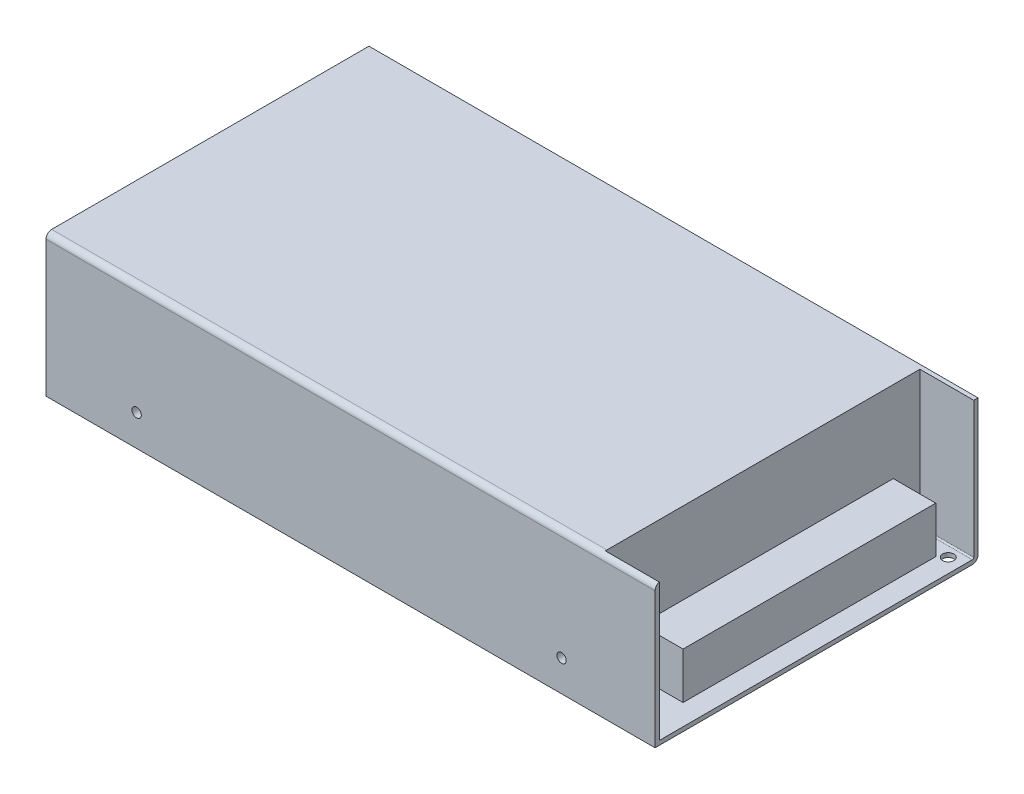
ISO-10303-21;
HEADER;
FILE_DESCRIPTION(('STEP AP214'),'2;1');
FILE_NAME('part.step','',(''),(''),'','','');
FILE_SCHEMA(('AUTOMOTIVE_DESIGN { 1 0 10303 214 1 1 1 1 }'));
ENDSEC;
DATA;
#1=APPLICATION_CONTEXT('core data for automotive mechanical design processes');
#2=APPLICATION_PROTOCOL_DEFINITION('international standard','automotive_design',2000,#1);
#3=PRODUCT_CONTEXT('',#1,'mechanical');
#4=PRODUCT('Part','Part','',(#3));
#5=PRODUCT_RELATED_PRODUCT_CATEGORY('part','',(#4));
#6=PRODUCT_DEFINITION_FORMATION('','',#4);
#7=PRODUCT_DEFINITION_CONTEXT('part definition',#1,'design');
#8=PRODUCT_DEFINITION('design','',#6,#7);
#9=PRODUCT_DEFINITION_SHAPE('','',#8);
#10=(LENGTH_UNIT() NAMED_UNIT(*) SI_UNIT(.MILLI.,.METRE.));
#11=(NAMED_UNIT(*) PLANE_ANGLE_UNIT() SI_UNIT($,.RADIAN.));
#12=(NAMED_UNIT(*) SI_UNIT($,.STERADIAN.) SOLID_ANGLE_UNIT());
#13=UNCERTAINTY_MEASURE_WITH_UNIT(LENGTH_MEASURE(1.E-05),#10,'distance_accuracy_value','');
#14=(GEOMETRIC_REPRESENTATION_CONTEXT(3) GLOBAL_UNCERTAINTY_ASSIGNED_CONTEXT((#13)) GLOBAL_UNIT_ASSIGNED_CONTEXT((#10,
#11,#12)) REPRESENTATION_CONTEXT('',''));
#15=CARTESIAN_POINT('',(0.,0.,0.));
#16=DIRECTION('',(0.,0.,1.));
#17=DIRECTION('',(1.,0.,0.));
#18=AXIS2_PLACEMENT_3D('',#15,#16,#17);
#19=CARTESIAN_POINT('',(88.5,0.,0.));
#20=DIRECTION('',(1.,0.,0.));
#21=DIRECTION('',(0.,0.,-1.));
#22=AXIS2_PLACEMENT_3D('',#19,#20,#21);
#23=PLANE('',#22);
#24=DIRECTION('',(0.,0.,1.));
#25=VECTOR('',#24,1.);
#26=CARTESIAN_POINT('',(88.5,50.,55.5));
#27=LINE('',#26,#25);
#28=CARTESIAN_POINT('',(88.5,50.,-55.5));
#29=VERTEX_POINT('',#28);
#30=CARTESIAN_POINT('',(88.5,50.,55.));
#31=VERTEX_POINT('',#30);
#32=EDGE_CURVE('E263',#29,#31,#27,.T.);
#33=ORIENTED_EDGE('',*,*,#32,.T.);
#34=CARTESIAN_POINT('',(88.5,48.,55.));
#35=DIRECTION('',(1.,0.,0.));
#36=DIRECTION('',(0.,0.,-1.));
#37=AXIS2_PLACEMENT_3D('',#34,#35,#36);
#38=CIRCLE('',#37,2.);
#39=CARTESIAN_POINT('',(88.5,49.9364916731037,55.5));
#40=VERTEX_POINT('',#39);
#41=EDGE_CURVE('E40',#31,#40,#38,.T.);
#42=ORIENTED_EDGE('',*,*,#41,.T.);
#43=DIRECTION('',(0.,-1.,0.));
#44=VECTOR('',#43,1.);
#45=CARTESIAN_POINT('',(88.5,50.,55.5));
#46=LINE('',#45,#44);
#47=CARTESIAN_POINT('',(88.5,1.5,55.5));
#48=VERTEX_POINT('',#47);
#49=EDGE_CURVE('E255',#40,#48,#46,.T.);
#50=ORIENTED_EDGE('',*,*,#49,.T.);
#51=DIRECTION('',(0.,0.,-1.));
#52=VECTOR('',#51,1.);
#53=CARTESIAN_POINT('',(88.5,1.5,55.5));
#54=LINE('',#53,#52);
#55=CARTESIAN_POINT('',(88.5,1.5,-55.));
#56=VERTEX_POINT('',#55);
#57=EDGE_CURVE('E257',#48,#56,#54,.T.);
#58=ORIENTED_EDGE('',*,*,#57,.T.);
#59=CARTESIAN_POINT('',(88.5,2.,-55.));
#60=DIRECTION('',(1.,0.,0.));
#61=DIRECTION('',(0.,0.,-1.));
#62=AXIS2_PLACEMENT_3D('',#59,#60,#61);
#63=CIRCLE('',#62,0.5);
#64=CARTESIAN_POINT('',(88.5,2.,-55.5));
#65=VERTEX_POINT('',#64);
#66=EDGE_CURVE('E307',#56,#65,#63,.T.);
#67=ORIENTED_EDGE('',*,*,#66,.T.);
#68=DIRECTION('',(0.,1.,0.));
#69=VECTOR('',#68,1.);
#70=CARTESIAN_POINT('',(88.5,50.,-55.5));
#71=LINE('',#70,#69);
#72=EDGE_CURVE('E261',#65,#29,#71,.T.);
#73=ORIENTED_EDGE('',*,*,#72,.T.);
#74=EDGE_LOOP('',(#33,#42,#50,#58,#67,#73));
#75=FACE_BOUND('',#74,.T.);
#76=DIRECTION('',(0.,0.,-1.));
#77=VECTOR('',#76,1.);
#78=CARTESIAN_POINT('',(88.5,4.89638068839784,43.1119440750721));
#79=LINE('',#78,#77);
#80=CARTESIAN_POINT('',(88.5,4.89638068839784,43.1119440750721));
#81=VERTEX_POINT('',#80);
#82=CARTESIAN_POINT('',(88.5,4.89638068839784,-46.093089144093));
#83=VERTEX_POINT('',#82);
#84=EDGE_CURVE('E241',#81,#83,#79,.T.);
#85=ORIENTED_EDGE('',*,*,#84,.F.);
#86=DIRECTION('',(0.,-1.,0.));
#87=VECTOR('',#86,1.);
#88=CARTESIAN_POINT('',(88.5,21.2544587594359,43.1119440750721));
#89=LINE('',#88,#87);
#90=CARTESIAN_POINT('',(88.5,21.2544587594359,43.1119440750721));
#91=VERTEX_POINT('',#90);
#92=EDGE_CURVE('E227',#91,#81,#89,.T.);
#93=ORIENTED_EDGE('',*,*,#92,.F.);
#94=DIRECTION('',(0.,0.,1.));
#95=VECTOR('',#94,1.);
#96=CARTESIAN_POINT('',(88.5,21.2544587594359,43.1119440750721));
#97=LINE('',#96,#95);
#98=CARTESIAN_POINT('',(88.5,21.2544587594359,-46.093089144093));
#99=VERTEX_POINT('',#98);
#100=EDGE_CURVE('E232',#99,#91,#97,.T.);
#101=ORIENTED_EDGE('',*,*,#100,.F.);
#102=DIRECTION('',(0.,1.,0.));
#103=VECTOR('',#102,1.);
#104=CARTESIAN_POINT('',(88.5,21.2544587594359,-46.093089144093));
#105=LINE('',#104,#103);
#106=EDGE_CURVE('E243',#83,#99,#105,.T.);
#107=ORIENTED_EDGE('',*,*,#106,.F.);
#108=EDGE_LOOP('',(#85,#93,#101,#107));
#109=FACE_BOUND('',#108,.T.);
#110=ADVANCED_FACE('F17',(#75,#109),#23,.T.);
#111=CARTESIAN_POINT('',(-107.5,50.,57.));
#112=DIRECTION('',(1.,0.,0.));
#113=DIRECTION('',(0.,0.,-1.));
#114=AXIS2_PLACEMENT_3D('',#111,#112,#113);
#115=PLANE('',#114);
#116=DIRECTION('',(0.,-1.,0.));
#117=VECTOR('',#116,1.);
#118=CARTESIAN_POINT('',(-107.5,50.,-57.));
#119=LINE('',#118,#117);
#120=CARTESIAN_POINT('',(-107.5,50.,-57.));
#121=VERTEX_POINT('',#120);
#122=CARTESIAN_POINT('',(-107.5,2.,-57.));
#123=VERTEX_POINT('',#122);
#124=EDGE_CURVE('E285',#121,#123,#119,.T.);
#125=ORIENTED_EDGE('',*,*,#124,.T.);
#126=CARTESIAN_POINT('',(-107.5,2.,-55.));
#127=DIRECTION('',(1.,0.,0.));
#128=DIRECTION('',(0.,0.,-1.));
#129=AXIS2_PLACEMENT_3D('',#126,#127,#128);
#130=CIRCLE('',#129,2.);
#131=CARTESIAN_POINT('',(-107.5,0.,-55.));
#132=VERTEX_POINT('',#131);
#133=EDGE_CURVE('E316',#123,#132,#130,.F.);
#134=ORIENTED_EDGE('',*,*,#133,.T.);
#135=DIRECTION('',(0.,0.,1.));
#136=VECTOR('',#135,1.);
#137=CARTESIAN_POINT('',(-107.5,0.,57.));
#138=LINE('',#137,#136);
#139=CARTESIAN_POINT('',(-107.5,0.,57.));
#140=VERTEX_POINT('',#139);
#141=EDGE_CURVE('E274',#132,#140,#138,.T.);
#142=ORIENTED_EDGE('',*,*,#141,.T.);
#143=DIRECTION('',(0.,-1.,0.));
#144=VECTOR('',#143,1.);
#145=CARTESIAN_POINT('',(-107.5,50.,57.));
#146=LINE('',#145,#144);
#147=CARTESIAN_POINT('',(-107.5,48.,57.));
#148=VERTEX_POINT('',#147);
#149=EDGE_CURVE('E300',#148,#140,#146,.T.);
#150=ORIENTED_EDGE('',*,*,#149,.F.);
#151=CARTESIAN_POINT('',(-107.5,48.,55.));
#152=DIRECTION('',(1.,0.,0.));
#153=DIRECTION('',(0.,0.,-1.));
#154=AXIS2_PLACEMENT_3D('',#151,#152,#153);
#155=CIRCLE('',#154,2.);
#156=CARTESIAN_POINT('',(-107.5,50.,55.));
#157=VERTEX_POINT('',#156);
#158=EDGE_CURVE('E314',#148,#157,#155,.F.);
#159=ORIENTED_EDGE('',*,*,#158,.T.);
#160=DIRECTION('',(0.,0.,1.));
#161=VECTOR('',#160,1.);
#162=CARTESIAN_POINT('',(-107.5,50.,57.));
#163=LINE('',#162,#161);
#164=EDGE_CURVE('E277',#121,#157,#163,.T.);
#165=ORIENTED_EDGE('',*,*,#164,.F.);
#166=EDGE_LOOP('',(#125,#134,#142,#150,#159,#165));
#167=FACE_BOUND('',#166,.T.);
#168=ADVANCED_FACE('F345',(#167),#115,.F.);
#169=CARTESIAN_POINT('',(107.5,50.,57.));
#170=DIRECTION('',(0.,0.,-1.));
#171=DIRECTION('',(-1.,0.,0.));
#172=AXIS2_PLACEMENT_3D('',#169,#170,#171);
#173=PLANE('',#172);
#174=CARTESIAN_POINT('',(74.5,11.,57.));
#175=DIRECTION('',(0.,0.,1.));
#176=DIRECTION('',(1.,0.,0.));
#177=AXIS2_PLACEMENT_3D('',#174,#175,#176);
#178=CIRCLE('',#177,1.65);
#179=CARTESIAN_POINT('',(76.15,11.,57.));
#180=VERTEX_POINT('',#179);
#181=EDGE_CURVE('E163',#180,#180,#178,.T.);
#182=ORIENTED_EDGE('',*,*,#181,.F.);
#183=EDGE_LOOP('',(#182));
#184=FACE_BOUND('',#183,.T.);
#185=CARTESIAN_POINT('',(-75.5,11.,57.));
#186=DIRECTION('',(0.,0.,1.));
#187=DIRECTION('',(1.,0.,0.));
#188=AXIS2_PLACEMENT_3D('',#185,#186,#187);
#189=CIRCLE('',#188,1.65);
#190=CARTESIAN_POINT('',(-73.85,11.,57.));
#191=VERTEX_POINT('',#190);
#192=EDGE_CURVE('E162',#191,#191,#189,.T.);
#193=ORIENTED_EDGE('',*,*,#192,.F.);
#194=EDGE_LOOP('',(#193));
#195=FACE_BOUND('',#194,.T.);
#196=DIRECTION('',(0.,-1.,0.));
#197=VECTOR('',#196,1.);
#198=CARTESIAN_POINT('',(107.5,50.,57.));
#199=LINE('',#198,#197);
#200=CARTESIAN_POINT('',(107.5,48.,57.));
#201=VERTEX_POINT('',#200);
#202=CARTESIAN_POINT('',(107.5,0.,57.));
#203=VERTEX_POINT('',#202);
#204=EDGE_CURVE('E298',#201,#203,#199,.T.);
#205=ORIENTED_EDGE('',*,*,#204,.F.);
#206=DIRECTION('',(1.,0.,0.));
#207=VECTOR('',#206,1.);
#208=CARTESIAN_POINT('',(-107.5,48.,57.));
#209=LINE('',#208,#207);
#210=EDGE_CURVE('E11',#201,#148,#209,.F.);
#211=ORIENTED_EDGE('',*,*,#210,.T.);
#212=ORIENTED_EDGE('',*,*,#149,.T.);
#213=DIRECTION('',(1.,0.,0.));
#214=VECTOR('',#213,1.);
#215=CARTESIAN_POINT('',(107.5,0.,57.));
#216=LINE('',#215,#214);
#217=EDGE_CURVE('E288',#140,#203,#216,.T.);
#218=ORIENTED_EDGE('',*,*,#217,.T.);
#219=EDGE_LOOP('',(#205,#211,#212,#218));
#220=FACE_BOUND('',#219,.T.);
#221=ADVANCED_FACE('F343',(#184,#195,#220),#173,.F.);
#222=CARTESIAN_POINT('',(107.5,50.,57.));
#223=DIRECTION('',(-1.,0.,0.));
#224=DIRECTION('',(0.,0.,1.));
#225=AXIS2_PLACEMENT_3D('',#222,#223,#224);
#226=PLANE('',#225);
#227=DIRECTION('',(0.,0.,-1.));
#228=VECTOR('',#227,1.);
#229=CARTESIAN_POINT('',(107.5,0.,57.));
#230=LINE('',#229,#228);
#231=CARTESIAN_POINT('',(107.5,0.,-55.));
#232=VERTEX_POINT('',#231);
#233=EDGE_CURVE('E281',#203,#232,#230,.T.);
#234=ORIENTED_EDGE('',*,*,#233,.T.);
#235=CARTESIAN_POINT('',(107.5,2.,-55.));
#236=DIRECTION('',(-1.,0.,0.));
#237=DIRECTION('',(0.,0.,1.));
#238=AXIS2_PLACEMENT_3D('',#235,#236,#237);
#239=CIRCLE('',#238,2.);
#240=CARTESIAN_POINT('',(107.5,2.,-57.));
#241=VERTEX_POINT('',#240);
#242=EDGE_CURVE('E322',#232,#241,#239,.F.);
#243=ORIENTED_EDGE('',*,*,#242,.T.);
#244=DIRECTION('',(0.,-1.,0.));
#245=VECTOR('',#244,1.);
#246=CARTESIAN_POINT('',(107.5,50.,-57.));
#247=LINE('',#246,#245);
#248=CARTESIAN_POINT('',(107.5,50.,-57.));
#249=VERTEX_POINT('',#248);
#250=EDGE_CURVE('E295',#249,#241,#247,.T.);
#251=ORIENTED_EDGE('',*,*,#250,.F.);
#252=DIRECTION('',(0.,0.,-1.));
#253=VECTOR('',#252,1.);
#254=CARTESIAN_POINT('',(107.5,50.,57.));
#255=LINE('',#254,#253);
#256=CARTESIAN_POINT('',(107.5,50.,-55.5));
#257=VERTEX_POINT('',#256);
#258=EDGE_CURVE('E280',#257,#249,#255,.T.);
#259=ORIENTED_EDGE('',*,*,#258,.F.);
#260=DIRECTION('',(0.,1.,0.));
#261=VECTOR('',#260,1.);
#262=CARTESIAN_POINT('',(107.5,50.,-55.5));
#263=LINE('',#262,#261);
#264=CARTESIAN_POINT('',(107.5,2.,-55.5));
#265=VERTEX_POINT('',#264);
#266=EDGE_CURVE('E258',#265,#257,#263,.T.);
#267=ORIENTED_EDGE('',*,*,#266,.F.);
#268=CARTESIAN_POINT('',(107.5,2.,-55.));
#269=DIRECTION('',(-1.,0.,0.));
#270=DIRECTION('',(0.,0.,1.));
#271=AXIS2_PLACEMENT_3D('',#268,#269,#270);
#272=CIRCLE('',#271,0.5);
#273=CARTESIAN_POINT('',(107.5,1.5,-55.));
#274=VERTEX_POINT('',#273);
#275=EDGE_CURVE('E309',#265,#274,#272,.T.);
#276=ORIENTED_EDGE('',*,*,#275,.T.);
#277=DIRECTION('',(0.,0.,-1.));
#278=VECTOR('',#277,1.);
#279=CARTESIAN_POINT('',(107.5,1.5,55.5));
#280=LINE('',#279,#278);
#281=CARTESIAN_POINT('',(107.5,1.5,55.5));
#282=VERTEX_POINT('',#281);
#283=EDGE_CURVE('E267',#282,#274,#280,.T.);
#284=ORIENTED_EDGE('',*,*,#283,.F.);
#285=DIRECTION('',(0.,-1.,0.));
#286=VECTOR('',#285,1.);
#287=CARTESIAN_POINT('',(107.5,50.,55.5));
#288=LINE('',#287,#286);
#289=CARTESIAN_POINT('',(107.5,49.9364916731037,55.5));
#290=VERTEX_POINT('',#289);
#291=EDGE_CURVE('E254',#290,#282,#288,.T.);
#292=ORIENTED_EDGE('',*,*,#291,.F.);
#293=CARTESIAN_POINT('',(107.5,48.,55.));
#294=DIRECTION('',(-1.,0.,0.));
#295=DIRECTION('',(0.,0.,1.));
#296=AXIS2_PLACEMENT_3D('',#293,#294,#295);
#297=CIRCLE('',#296,2.);
#298=EDGE_CURVE('E320',#290,#201,#297,.F.);
#299=ORIENTED_EDGE('',*,*,#298,.T.);
#300=ORIENTED_EDGE('',*,*,#204,.T.);
#301=EDGE_LOOP('',(#234,#243,#251,#259,#267,#276,#284,#292,#299,#300));
#302=FACE_BOUND('',#301,.T.);
#303=ADVANCED_FACE('F336',(#302),#226,.F.);
#304=CARTESIAN_POINT('',(107.5,50.,-57.));
#305=DIRECTION('',(0.,0.,1.));
#306=DIRECTION('',(1.,0.,0.));
#307=AXIS2_PLACEMENT_3D('',#304,#305,#306);
#308=PLANE('',#307);
#309=CARTESIAN_POINT('',(-74.2,37.5,-57.));
#310=DIRECTION('',(0.,0.,-1.));
#311=DIRECTION('',(-1.,0.,0.));
#312=AXIS2_PLACEMENT_3D('',#309,#310,#311);
#313=CIRCLE('',#312,1.65);
#314=CARTESIAN_POINT('',(-75.85,37.5,-57.));
#315=VERTEX_POINT('',#314);
#316=EDGE_CURVE('E177',#315,#315,#313,.T.);
#317=ORIENTED_EDGE('',*,*,#316,.F.);
#318=EDGE_LOOP('',(#317));
#319=FACE_BOUND('',#318,.T.);
#320=CARTESIAN_POINT('',(-74.2,12.5,-57.));
#321=DIRECTION('',(0.,0.,-1.));
#322=DIRECTION('',(-1.,0.,0.));
#323=AXIS2_PLACEMENT_3D('',#320,#321,#322);
#324=CIRCLE('',#323,1.65);
#325=CARTESIAN_POINT('',(-75.85,12.5,-57.));
#326=VERTEX_POINT('',#325);
#327=EDGE_CURVE('E185',#326,#326,#324,.T.);
#328=ORIENTED_EDGE('',*,*,#327,.F.);
#329=EDGE_LOOP('',(#328));
#330=FACE_BOUND('',#329,.T.);
#331=CARTESIAN_POINT('',(75.,37.5,-57.));
#332=DIRECTION('',(0.,0.,-1.));
#333=DIRECTION('',(-1.,0.,0.));
#334=AXIS2_PLACEMENT_3D('',#331,#332,#333);
#335=CIRCLE('',#334,1.65);
#336=CARTESIAN_POINT('',(73.35,37.5,-57.));
#337=VERTEX_POINT('',#336);
#338=EDGE_CURVE('E191',#337,#337,#335,.T.);
#339=ORIENTED_EDGE('',*,*,#338,.F.);
#340=EDGE_LOOP('',(#339));
#341=FACE_BOUND('',#340,.T.);
#342=CARTESIAN_POINT('',(75.,12.5,-57.));
#343=DIRECTION('',(0.,0.,-1.));
#344=DIRECTION('',(-1.,0.,0.));
#345=AXIS2_PLACEMENT_3D('',#342,#343,#344);
#346=CIRCLE('',#345,1.65);
#347=CARTESIAN_POINT('',(73.35,12.5,-57.));
#348=VERTEX_POINT('',#347);
#349=EDGE_CURVE('E197',#348,#348,#346,.T.);
#350=ORIENTED_EDGE('',*,*,#349,.F.);
#351=EDGE_LOOP('',(#350));
#352=FACE_BOUND('',#351,.T.);
#353=ORIENTED_EDGE('',*,*,#250,.T.);
#354=DIRECTION('',(-1.,0.,0.));
#355=VECTOR('',#354,1.);
#356=CARTESIAN_POINT('',(107.5,2.,-57.));
#357=LINE('',#356,#355);
#358=EDGE_CURVE('E311',#241,#123,#357,.T.);
#359=ORIENTED_EDGE('',*,*,#358,.T.);
#360=ORIENTED_EDGE('',*,*,#124,.F.);
#361=DIRECTION('',(-1.,0.,0.));
#362=VECTOR('',#361,1.);
#363=CARTESIAN_POINT('',(107.5,50.,-57.));
#364=LINE('',#363,#362);
#365=EDGE_CURVE('E283',#249,#121,#364,.T.);
#366=ORIENTED_EDGE('',*,*,#365,.F.);
#367=EDGE_LOOP('',(#353,#359,#360,#366));
#368=FACE_BOUND('',#367,.T.);
#369=ADVANCED_FACE('F360',(#319,#330,#341,#352,#368),#308,.F.);
#370=CARTESIAN_POINT('',(0.,50.,0.));
#371=DIRECTION('',(0.,1.,0.));
#372=DIRECTION('',(0.,0.,1.));
#373=AXIS2_PLACEMENT_3D('',#370,#371,#372);
#374=PLANE('',#373);
#375=ORIENTED_EDGE('',*,*,#164,.T.);
#376=DIRECTION('',(1.,0.,0.));
#377=VECTOR('',#376,1.);
#378=CARTESIAN_POINT('',(107.5,50.,55.));
#379=LINE('',#378,#377);
#380=EDGE_CURVE('E324',#157,#31,#379,.T.);
#381=ORIENTED_EDGE('',*,*,#380,.T.);
#382=ORIENTED_EDGE('',*,*,#32,.F.);
#383=DIRECTION('',(1.,0.,0.));
#384=VECTOR('',#383,1.);
#385=CARTESIAN_POINT('',(88.5,50.,-55.5));
#386=LINE('',#385,#384);
#387=EDGE_CURVE('E271',#29,#257,#386,.T.);
#388=ORIENTED_EDGE('',*,*,#387,.T.);
#389=ORIENTED_EDGE('',*,*,#258,.T.);
#390=ORIENTED_EDGE('',*,*,#365,.T.);
#391=EDGE_LOOP('',(#375,#381,#382,#388,#389,#390));
#392=FACE_BOUND('',#391,.T.);
#393=ADVANCED_FACE('F363',(#392),#374,.T.);
#394=CARTESIAN_POINT('',(0.,0.,0.));
#395=DIRECTION('',(0.,1.,0.));
#396=DIRECTION('',(0.,0.,1.));
#397=AXIS2_PLACEMENT_3D('',#394,#395,#396);
#398=PLANE('',#397);
#399=CARTESIAN_POINT('',(102.5,0.,-51.5));
#400=DIRECTION('',(0.,1.,0.));
#401=DIRECTION('',(0.,0.,1.));
#402=AXIS2_PLACEMENT_3D('',#399,#400,#401);
#403=CIRCLE('',#402,2.);
#404=CARTESIAN_POINT('',(102.5,0.,-49.5));
#405=VERTEX_POINT('',#404);
#406=EDGE_CURVE('E174',#405,#405,#403,.T.);
#407=ORIENTED_EDGE('',*,*,#406,.T.);
#408=EDGE_LOOP('',(#407));
#409=FACE_BOUND('',#408,.T.);
#410=CARTESIAN_POINT('',(-75.5,0.,-25.));
#411=DIRECTION('',(0.,-1.,0.));
#412=DIRECTION('',(0.,0.,-1.));
#413=AXIS2_PLACEMENT_3D('',#410,#411,#412);
#414=CIRCLE('',#413,1.65);
#415=CARTESIAN_POINT('',(-75.5,0.,-26.65));
#416=VERTEX_POINT('',#415);
#417=EDGE_CURVE('E203',#416,#416,#414,.T.);
#418=ORIENTED_EDGE('',*,*,#417,.F.);
#419=EDGE_LOOP('',(#418));
#420=FACE_BOUND('',#419,.T.);
#421=CARTESIAN_POINT('',(-75.5,0.,25.));
#422=DIRECTION('',(0.,-1.,0.));
#423=DIRECTION('',(0.,0.,-1.));
#424=AXIS2_PLACEMENT_3D('',#421,#422,#423);
#425=CIRCLE('',#424,1.65);
#426=CARTESIAN_POINT('',(-75.5,0.,23.35));
#427=VERTEX_POINT('',#426);
#428=EDGE_CURVE('E209',#427,#427,#425,.T.);
#429=ORIENTED_EDGE('',*,*,#428,.F.);
#430=EDGE_LOOP('',(#429));
#431=FACE_BOUND('',#430,.T.);
#432=CARTESIAN_POINT('',(74.5,0.,-25.));
#433=DIRECTION('',(0.,-1.,0.));
#434=DIRECTION('',(0.,0.,-1.));
#435=AXIS2_PLACEMENT_3D('',#432,#433,#434);
#436=CIRCLE('',#435,1.65);
#437=CARTESIAN_POINT('',(74.5,0.,-26.65));
#438=VERTEX_POINT('',#437);
#439=EDGE_CURVE('E215',#438,#438,#436,.T.);
#440=ORIENTED_EDGE('',*,*,#439,.F.);
#441=EDGE_LOOP('',(#440));
#442=FACE_BOUND('',#441,.T.);
#443=CARTESIAN_POINT('',(74.5,0.,25.));
#444=DIRECTION('',(0.,-1.,0.));
#445=DIRECTION('',(0.,0.,-1.));
#446=AXIS2_PLACEMENT_3D('',#443,#444,#445);
#447=CIRCLE('',#446,1.65);
#448=CARTESIAN_POINT('',(74.5,0.,23.35));
#449=VERTEX_POINT('',#448);
#450=EDGE_CURVE('E221',#449,#449,#447,.T.);
#451=ORIENTED_EDGE('',*,*,#450,.F.);
#452=EDGE_LOOP('',(#451));
#453=FACE_BOUND('',#452,.T.);
#454=ORIENTED_EDGE('',*,*,#141,.F.);
#455=DIRECTION('',(-1.,0.,0.));
#456=VECTOR('',#455,1.);
#457=CARTESIAN_POINT('',(0.,0.,-55.));
#458=LINE('',#457,#456);
#459=EDGE_CURVE('E318',#132,#232,#458,.F.);
#460=ORIENTED_EDGE('',*,*,#459,.T.);
#461=ORIENTED_EDGE('',*,*,#233,.F.);
#462=ORIENTED_EDGE('',*,*,#217,.F.);
#463=EDGE_LOOP('',(#454,#460,#461,#462));
#464=FACE_BOUND('',#463,.T.);
#465=ADVANCED_FACE('F352',(#409,#420,#431,#442,#453,#464),#398,.F.);
#466=CARTESIAN_POINT('',(88.5,50.,55.5));
#467=DIRECTION('',(0.,0.,1.));
#468=DIRECTION('',(1.,0.,0.));
#469=AXIS2_PLACEMENT_3D('',#466,#467,#468);
#470=PLANE('',#469);
#471=ORIENTED_EDGE('',*,*,#49,.F.);
#472=DIRECTION('',(-1.,0.,0.));
#473=VECTOR('',#472,1.);
#474=CARTESIAN_POINT('',(88.5,49.9364916731037,55.5));
#475=LINE('',#474,#473);
#476=EDGE_CURVE('E25',#40,#290,#475,.F.);
#477=ORIENTED_EDGE('',*,*,#476,.T.);
#478=ORIENTED_EDGE('',*,*,#291,.T.);
#479=DIRECTION('',(1.,0.,0.));
#480=VECTOR('',#479,1.);
#481=CARTESIAN_POINT('',(88.5,1.5,55.5));
#482=LINE('',#481,#480);
#483=EDGE_CURVE('E265',#48,#282,#482,.T.);
#484=ORIENTED_EDGE('',*,*,#483,.F.);
#485=EDGE_LOOP('',(#471,#477,#478,#484));
#486=FACE_BOUND('',#485,.T.);
#487=ADVANCED_FACE('F330',(#486),#470,.F.);
#488=CARTESIAN_POINT('',(88.5,50.,-55.5));
#489=DIRECTION('',(0.,0.,-1.));
#490=DIRECTION('',(-1.,0.,0.));
#491=AXIS2_PLACEMENT_3D('',#488,#489,#490);
#492=PLANE('',#491);
#493=ORIENTED_EDGE('',*,*,#72,.F.);
#494=DIRECTION('',(1.,0.,0.));
#495=VECTOR('',#494,1.);
#496=CARTESIAN_POINT('',(107.5,2.,-55.5));
#497=LINE('',#496,#495);
#498=EDGE_CURVE('E302',#65,#265,#497,.T.);
#499=ORIENTED_EDGE('',*,*,#498,.T.);
#500=ORIENTED_EDGE('',*,*,#266,.T.);
#501=ORIENTED_EDGE('',*,*,#387,.F.);
#502=EDGE_LOOP('',(#493,#499,#500,#501));
#503=FACE_BOUND('',#502,.T.);
#504=ADVANCED_FACE('F370',(#503),#492,.F.);
#505=CARTESIAN_POINT('',(88.5,1.5,55.5));
#506=DIRECTION('',(0.,-1.,0.));
#507=DIRECTION('',(0.,0.,-1.));
#508=AXIS2_PLACEMENT_3D('',#505,#506,#507);
#509=PLANE('',#508);
#510=CARTESIAN_POINT('',(102.5,1.5,-51.5));
#511=DIRECTION('',(0.,1.,0.));
#512=DIRECTION('',(0.,0.,1.));
#513=AXIS2_PLACEMENT_3D('',#510,#511,#512);
#514=CIRCLE('',#513,2.);
#515=CARTESIAN_POINT('',(102.5,1.5,-49.5));
#516=VERTEX_POINT('',#515);
#517=EDGE_CURVE('E173',#516,#516,#514,.T.);
#518=ORIENTED_EDGE('',*,*,#517,.F.);
#519=EDGE_LOOP('',(#518));
#520=FACE_BOUND('',#519,.T.);
#521=ORIENTED_EDGE('',*,*,#283,.T.);
#522=DIRECTION('',(1.,0.,0.));
#523=VECTOR('',#522,1.);
#524=CARTESIAN_POINT('',(88.5,1.5,-55.));
#525=LINE('',#524,#523);
#526=EDGE_CURVE('E305',#274,#56,#525,.F.);
#527=ORIENTED_EDGE('',*,*,#526,.T.);
#528=ORIENTED_EDGE('',*,*,#57,.F.);
#529=ORIENTED_EDGE('',*,*,#483,.T.);
#530=EDGE_LOOP('',(#521,#527,#528,#529));
#531=FACE_BOUND('',#530,.T.);
#532=ADVANCED_FACE('F378',(#520,#531),#509,.F.);
#533=CARTESIAN_POINT('',(88.5,2.,-55.));
#534=DIRECTION('',(-1.,0.,0.));
#535=DIRECTION('',(0.,0.,1.));
#536=AXIS2_PLACEMENT_3D('',#533,#534,#535);
#537=CYLINDRICAL_SURFACE('',#536,0.5);
#538=ORIENTED_EDGE('',*,*,#66,.F.);
#539=ORIENTED_EDGE('',*,*,#526,.F.);
#540=ORIENTED_EDGE('',*,*,#275,.F.);
#541=ORIENTED_EDGE('',*,*,#498,.F.);
#542=EDGE_LOOP('',(#538,#539,#540,#541));
#543=FACE_BOUND('',#542,.T.);
#544=ADVANCED_FACE('F374',(#543),#537,.F.);
#545=CARTESIAN_POINT('',(107.5,2.,-55.));
#546=DIRECTION('',(-1.,0.,0.));
#547=DIRECTION('',(0.,0.,1.));
#548=AXIS2_PLACEMENT_3D('',#545,#546,#547);
#549=CYLINDRICAL_SURFACE('',#548,2.);
#550=ORIENTED_EDGE('',*,*,#242,.F.);
#551=ORIENTED_EDGE('',*,*,#459,.F.);
#552=ORIENTED_EDGE('',*,*,#133,.F.);
#553=ORIENTED_EDGE('',*,*,#358,.F.);
#554=EDGE_LOOP('',(#550,#551,#552,#553));
#555=FACE_BOUND('',#554,.T.);
#556=ADVANCED_FACE('F357',(#555),#549,.T.);
#557=CARTESIAN_POINT('',(0.,48.,55.));
#558=DIRECTION('',(-1.,0.,0.));
#559=DIRECTION('',(0.,0.,1.));
#560=AXIS2_PLACEMENT_3D('',#557,#558,#559);
#561=CYLINDRICAL_SURFACE('',#560,2.);
#562=ORIENTED_EDGE('',*,*,#158,.F.);
#563=ORIENTED_EDGE('',*,*,#210,.F.);
#564=ORIENTED_EDGE('',*,*,#298,.F.);
#565=ORIENTED_EDGE('',*,*,#476,.F.);
#566=ORIENTED_EDGE('',*,*,#41,.F.);
#567=ORIENTED_EDGE('',*,*,#380,.F.);
#568=EDGE_LOOP('',(#562,#563,#564,#565,#566,#567));
#569=FACE_BOUND('',#568,.T.);
#570=ADVANCED_FACE('F19',(#569),#561,.T.);
#571=CARTESIAN_POINT('',(103.5,21.2544587594359,43.1119440750721));
#572=DIRECTION('',(0.,0.,-1.));
#573=DIRECTION('',(-1.,0.,0.));
#574=AXIS2_PLACEMENT_3D('',#571,#572,#573);
#575=PLANE('',#574);
#576=ORIENTED_EDGE('',*,*,#92,.T.);
#577=DIRECTION('',(-1.,0.,0.));
#578=VECTOR('',#577,1.);
#579=CARTESIAN_POINT('',(103.5,4.89638068839784,43.1119440750721));
#580=LINE('',#579,#578);
#581=CARTESIAN_POINT('',(103.5,4.89638068839784,43.1119440750721));
#582=VERTEX_POINT('',#581);
#583=EDGE_CURVE('E252',#582,#81,#580,.T.);
#584=ORIENTED_EDGE('',*,*,#583,.F.);
#585=DIRECTION('',(0.,-1.,0.));
#586=VECTOR('',#585,1.);
#587=CARTESIAN_POINT('',(103.5,21.2544587594359,43.1119440750721));
#588=LINE('',#587,#586);
#589=CARTESIAN_POINT('',(103.5,21.2544587594359,43.1119440750721));
#590=VERTEX_POINT('',#589);
#591=EDGE_CURVE('E228',#590,#582,#588,.T.);
#592=ORIENTED_EDGE('',*,*,#591,.F.);
#593=DIRECTION('',(-1.,0.,0.));
#594=VECTOR('',#593,1.);
#595=CARTESIAN_POINT('',(103.5,21.2544587594359,43.1119440750721));
#596=LINE('',#595,#594);
#597=EDGE_CURVE('E238',#590,#91,#596,.T.);
#598=ORIENTED_EDGE('',*,*,#597,.T.);
#599=EDGE_LOOP('',(#576,#584,#592,#598));
#600=FACE_BOUND('',#599,.T.);
#601=ADVANCED_FACE('F398',(#600),#575,.F.);
#602=CARTESIAN_POINT('',(103.5,4.89638068839784,43.1119440750721));
#603=DIRECTION('',(0.,1.,0.));
#604=DIRECTION('',(-1.,0.,0.));
#605=AXIS2_PLACEMENT_3D('',#602,#603,#604);
#606=PLANE('',#605);
#607=ORIENTED_EDGE('',*,*,#84,.T.);
#608=DIRECTION('',(-1.,0.,0.));
#609=VECTOR('',#608,1.);
#610=CARTESIAN_POINT('',(103.5,4.89638068839784,-46.093089144093));
#611=LINE('',#610,#609);
#612=CARTESIAN_POINT('',(103.5,4.89638068839784,-46.093089144093));
#613=VERTEX_POINT('',#612);
#614=EDGE_CURVE('E249',#613,#83,#611,.T.);
#615=ORIENTED_EDGE('',*,*,#614,.F.);
#616=DIRECTION('',(0.,0.,-1.));
#617=VECTOR('',#616,1.);
#618=CARTESIAN_POINT('',(103.5,4.89638068839784,43.1119440750721));
#619=LINE('',#618,#617);
#620=EDGE_CURVE('E231',#582,#613,#619,.T.);
#621=ORIENTED_EDGE('',*,*,#620,.F.);
#622=ORIENTED_EDGE('',*,*,#583,.T.);
#623=EDGE_LOOP('',(#607,#615,#621,#622));
#624=FACE_BOUND('',#623,.T.);
#625=ADVANCED_FACE('F388',(#624),#606,.F.);
#626=CARTESIAN_POINT('',(103.5,21.2544587594359,-46.093089144093));
#627=DIRECTION('',(0.,0.,1.));
#628=DIRECTION('',(1.,0.,0.));
#629=AXIS2_PLACEMENT_3D('',#626,#627,#628);
#630=PLANE('',#629);
#631=ORIENTED_EDGE('',*,*,#106,.T.);
#632=DIRECTION('',(-1.,0.,0.));
#633=VECTOR('',#632,1.);
#634=CARTESIAN_POINT('',(103.5,21.2544587594359,-46.093089144093));
#635=LINE('',#634,#633);
#636=CARTESIAN_POINT('',(103.5,21.2544587594359,-46.093089144093));
#637=VERTEX_POINT('',#636);
#638=EDGE_CURVE('E32',#637,#99,#635,.T.);
#639=ORIENTED_EDGE('',*,*,#638,.F.);
#640=DIRECTION('',(0.,1.,0.));
#641=VECTOR('',#640,1.);
#642=CARTESIAN_POINT('',(103.5,21.2544587594359,-46.093089144093));
#643=LINE('',#642,#641);
#644=EDGE_CURVE('E234',#613,#637,#643,.T.);
#645=ORIENTED_EDGE('',*,*,#644,.F.);
#646=ORIENTED_EDGE('',*,*,#614,.T.);
#647=EDGE_LOOP('',(#631,#639,#645,#646));
#648=FACE_BOUND('',#647,.T.);
#649=ADVANCED_FACE('F392',(#648),#630,.F.);
#650=CARTESIAN_POINT('',(103.5,21.2544587594359,43.1119440750721));
#651=DIRECTION('',(0.,-1.,0.));
#652=DIRECTION('',(1.,0.,0.));
#653=AXIS2_PLACEMENT_3D('',#650,#651,#652);
#654=PLANE('',#653);
#655=ORIENTED_EDGE('',*,*,#100,.T.);
#656=ORIENTED_EDGE('',*,*,#597,.F.);
#657=DIRECTION('',(0.,0.,1.));
#658=VECTOR('',#657,1.);
#659=CARTESIAN_POINT('',(103.5,21.2544587594359,43.1119440750721));
#660=LINE('',#659,#658);
#661=EDGE_CURVE('E236',#637,#590,#660,.T.);
#662=ORIENTED_EDGE('',*,*,#661,.F.);
#663=ORIENTED_EDGE('',*,*,#638,.T.);
#664=EDGE_LOOP('',(#655,#656,#662,#663));
#665=FACE_BOUND('',#664,.T.);
#666=ADVANCED_FACE('F399',(#665),#654,.F.);
#667=CARTESIAN_POINT('',(103.5,0.,0.));
#668=DIRECTION('',(1.,0.,0.));
#669=DIRECTION('',(0.,0.,-1.));
#670=AXIS2_PLACEMENT_3D('',#667,#668,#669);
#671=PLANE('',#670);
#672=ORIENTED_EDGE('',*,*,#591,.T.);
#673=ORIENTED_EDGE('',*,*,#620,.T.);
#674=ORIENTED_EDGE('',*,*,#644,.T.);
#675=ORIENTED_EDGE('',*,*,#661,.T.);
#676=EDGE_LOOP('',(#672,#673,#674,#675));
#677=FACE_BOUND('',#676,.T.);
#678=ADVANCED_FACE('F394',(#677),#671,.T.);
#679=CARTESIAN_POINT('',(74.5,11.5,25.));
#680=DIRECTION('',(0.,-1.,0.));
#681=DIRECTION('',(0.,0.,-1.));
#682=AXIS2_PLACEMENT_3D('',#679,#680,#681);
#683=CONICAL_SURFACE('',#682,1.65,1.02974425867665);
#684=CARTESIAN_POINT('',(74.5,12.4914200213955,25.));
#685=VERTEX_POINT('',#684);
#686=VERTEX_LOOP('',#685);
#687=FACE_BOUND('',#686,.T.);
#688=CARTESIAN_POINT('',(74.5,11.5,25.));
#689=DIRECTION('',(0.,-1.,0.));
#690=DIRECTION('',(0.,0.,-1.));
#691=AXIS2_PLACEMENT_3D('',#688,#689,#690);
#692=CIRCLE('',#691,1.65);
#693=CARTESIAN_POINT('',(74.5,11.5,23.35));
#694=VERTEX_POINT('',#693);
#695=EDGE_CURVE('E224',#694,#694,#692,.T.);
#696=ORIENTED_EDGE('',*,*,#695,.T.);
#697=EDGE_LOOP('',(#696));
#698=FACE_BOUND('',#697,.T.);
#699=ADVANCED_FACE('F408',(#687,#698),#683,.F.);
#700=CARTESIAN_POINT('',(74.5,0.,25.));
#701=DIRECTION('',(0.,-1.,0.));
#702=DIRECTION('',(0.,0.,-1.));
#703=AXIS2_PLACEMENT_3D('',#700,#701,#702);
#704=CYLINDRICAL_SURFACE('',#703,1.65);
#705=ORIENTED_EDGE('',*,*,#695,.F.);
#706=EDGE_LOOP('',(#705));
#707=FACE_BOUND('',#706,.T.);
#708=ORIENTED_EDGE('',*,*,#450,.T.);
#709=EDGE_LOOP('',(#708));
#710=FACE_BOUND('',#709,.T.);
#711=ADVANCED_FACE('F486',(#707,#710),#704,.F.);
#712=CARTESIAN_POINT('',(74.5,11.5,-25.));
#713=DIRECTION('',(0.,-1.,0.));
#714=DIRECTION('',(0.,0.,-1.));
#715=AXIS2_PLACEMENT_3D('',#712,#713,#714);
#716=CONICAL_SURFACE('',#715,1.65,1.02974425867665);
#717=CARTESIAN_POINT('',(74.5,12.4914200213955,-25.));
#718=VERTEX_POINT('',#717);
#719=VERTEX_LOOP('',#718);
#720=FACE_BOUND('',#719,.T.);
#721=CARTESIAN_POINT('',(74.5,11.5,-25.));
#722=DIRECTION('',(0.,-1.,0.));
#723=DIRECTION('',(0.,0.,-1.));
#724=AXIS2_PLACEMENT_3D('',#721,#722,#723);
#725=CIRCLE('',#724,1.65);
#726=CARTESIAN_POINT('',(74.5,11.5,-26.65));
#727=VERTEX_POINT('',#726);
#728=EDGE_CURVE('E218',#727,#727,#725,.T.);
#729=ORIENTED_EDGE('',*,*,#728,.T.);
#730=EDGE_LOOP('',(#729));
#731=FACE_BOUND('',#730,.T.);
#732=ADVANCED_FACE('F495',(#720,#731),#716,.F.);
#733=CARTESIAN_POINT('',(74.5,0.,-25.));
#734=DIRECTION('',(0.,-1.,0.));
#735=DIRECTION('',(0.,0.,-1.));
#736=AXIS2_PLACEMENT_3D('',#733,#734,#735);
#737=CYLINDRICAL_SURFACE('',#736,1.65);
#738=ORIENTED_EDGE('',*,*,#728,.F.);
#739=EDGE_LOOP('',(#738));
#740=FACE_BOUND('',#739,.T.);
#741=ORIENTED_EDGE('',*,*,#439,.T.);
#742=EDGE_LOOP('',(#741));
#743=FACE_BOUND('',#742,.T.);
#744=ADVANCED_FACE('F506',(#740,#743),#737,.F.);
#745=CARTESIAN_POINT('',(-75.5,11.5,25.));
#746=DIRECTION('',(0.,-1.,0.));
#747=DIRECTION('',(0.,0.,-1.));
#748=AXIS2_PLACEMENT_3D('',#745,#746,#747);
#749=CONICAL_SURFACE('',#748,1.65,1.02974425867665);
#750=CARTESIAN_POINT('',(-75.5,12.4914200213955,25.));
#751=VERTEX_POINT('',#750);
#752=VERTEX_LOOP('',#751);
#753=FACE_BOUND('',#752,.T.);
#754=CARTESIAN_POINT('',(-75.5,11.5,25.));
#755=DIRECTION('',(0.,-1.,0.));
#756=DIRECTION('',(0.,0.,-1.));
#757=AXIS2_PLACEMENT_3D('',#754,#755,#756);
#758=CIRCLE('',#757,1.65);
#759=CARTESIAN_POINT('',(-75.5,11.5,23.35));
#760=VERTEX_POINT('',#759);
#761=EDGE_CURVE('E212',#760,#760,#758,.T.);
#762=ORIENTED_EDGE('',*,*,#761,.T.);
#763=EDGE_LOOP('',(#762));
#764=FACE_BOUND('',#763,.T.);
#765=ADVANCED_FACE('F516',(#753,#764),#749,.F.);
#766=CARTESIAN_POINT('',(-75.5,0.,25.));
#767=DIRECTION('',(0.,-1.,0.));
#768=DIRECTION('',(0.,0.,-1.));
#769=AXIS2_PLACEMENT_3D('',#766,#767,#768);
#770=CYLINDRICAL_SURFACE('',#769,1.65);
#771=ORIENTED_EDGE('',*,*,#761,.F.);
#772=EDGE_LOOP('',(#771));
#773=FACE_BOUND('',#772,.T.);
#774=ORIENTED_EDGE('',*,*,#428,.T.);
#775=EDGE_LOOP('',(#774));
#776=FACE_BOUND('',#775,.T.);
#777=ADVANCED_FACE('F527',(#773,#776),#770,.F.);
#778=CARTESIAN_POINT('',(-75.5,11.5,-25.));
#779=DIRECTION('',(0.,-1.,0.));
#780=DIRECTION('',(0.,0.,-1.));
#781=AXIS2_PLACEMENT_3D('',#778,#779,#780);
#782=CONICAL_SURFACE('',#781,1.65,1.02974425867665);
#783=CARTESIAN_POINT('',(-75.5,12.4914200213955,-25.));
#784=VERTEX_POINT('',#783);
#785=VERTEX_LOOP('',#784);
#786=FACE_BOUND('',#785,.T.);
#787=CARTESIAN_POINT('',(-75.5,11.5,-25.));
#788=DIRECTION('',(0.,-1.,0.));
#789=DIRECTION('',(0.,0.,-1.));
#790=AXIS2_PLACEMENT_3D('',#787,#788,#789);
#791=CIRCLE('',#790,1.65);
#792=CARTESIAN_POINT('',(-75.5,11.5,-26.65));
#793=VERTEX_POINT('',#792);
#794=EDGE_CURVE('E206',#793,#793,#791,.T.);
#795=ORIENTED_EDGE('',*,*,#794,.T.);
#796=EDGE_LOOP('',(#795));
#797=FACE_BOUND('',#796,.T.);
#798=ADVANCED_FACE('F537',(#786,#797),#782,.F.);
#799=CARTESIAN_POINT('',(-75.5,0.,-25.));
#800=DIRECTION('',(0.,-1.,0.));
#801=DIRECTION('',(0.,0.,-1.));
#802=AXIS2_PLACEMENT_3D('',#799,#800,#801);
#803=CYLINDRICAL_SURFACE('',#802,1.65);
#804=ORIENTED_EDGE('',*,*,#794,.F.);
#805=EDGE_LOOP('',(#804));
#806=FACE_BOUND('',#805,.T.);
#807=ORIENTED_EDGE('',*,*,#417,.T.);
#808=EDGE_LOOP('',(#807));
#809=FACE_BOUND('',#808,.T.);
#810=ADVANCED_FACE('F548',(#806,#809),#803,.F.);
#811=CARTESIAN_POINT('',(75.,12.5,-45.5));
#812=DIRECTION('',(0.,0.,-1.));
#813=DIRECTION('',(-1.,0.,0.));
#814=AXIS2_PLACEMENT_3D('',#811,#812,#813);
#815=CONICAL_SURFACE('',#814,1.65,1.02974425867665);
#816=CARTESIAN_POINT('',(75.,12.5,-44.5085799786046));
#817=VERTEX_POINT('',#816);
#818=VERTEX_LOOP('',#817);
#819=FACE_BOUND('',#818,.T.);
#820=CARTESIAN_POINT('',(75.,12.5,-45.5));
#821=DIRECTION('',(0.,0.,-1.));
#822=DIRECTION('',(-1.,0.,0.));
#823=AXIS2_PLACEMENT_3D('',#820,#821,#822);
#824=CIRCLE('',#823,1.65);
#825=CARTESIAN_POINT('',(73.35,12.5,-45.5));
#826=VERTEX_POINT('',#825);
#827=EDGE_CURVE('E200',#826,#826,#824,.T.);
#828=ORIENTED_EDGE('',*,*,#827,.T.);
#829=EDGE_LOOP('',(#828));
#830=FACE_BOUND('',#829,.T.);
#831=ADVANCED_FACE('F558',(#819,#830),#815,.F.);
#832=CARTESIAN_POINT('',(75.,12.5,-57.));
#833=DIRECTION('',(0.,0.,-1.));
#834=DIRECTION('',(-1.,0.,0.));
#835=AXIS2_PLACEMENT_3D('',#832,#833,#834);
#836=CYLINDRICAL_SURFACE('',#835,1.65);
#837=ORIENTED_EDGE('',*,*,#827,.F.);
#838=EDGE_LOOP('',(#837));
#839=FACE_BOUND('',#838,.T.);
#840=ORIENTED_EDGE('',*,*,#349,.T.);
#841=EDGE_LOOP('',(#840));
#842=FACE_BOUND('',#841,.T.);
#843=ADVANCED_FACE('F569',(#839,#842),#836,.F.);
#844=CARTESIAN_POINT('',(75.,37.5,-45.5));
#845=DIRECTION('',(0.,0.,-1.));
#846=DIRECTION('',(-1.,0.,0.));
#847=AXIS2_PLACEMENT_3D('',#844,#845,#846);
#848=CONICAL_SURFACE('',#847,1.65,1.02974425867665);
#849=CARTESIAN_POINT('',(75.,37.5,-44.5085799786046));
#850=VERTEX_POINT('',#849);
#851=VERTEX_LOOP('',#850);
#852=FACE_BOUND('',#851,.T.);
#853=CARTESIAN_POINT('',(75.,37.5,-45.5));
#854=DIRECTION('',(0.,0.,-1.));
#855=DIRECTION('',(-1.,0.,0.));
#856=AXIS2_PLACEMENT_3D('',#853,#854,#855);
#857=CIRCLE('',#856,1.65);
#858=CARTESIAN_POINT('',(73.35,37.5,-45.5));
#859=VERTEX_POINT('',#858);
#860=EDGE_CURVE('E194',#859,#859,#857,.T.);
#861=ORIENTED_EDGE('',*,*,#860,.T.);
#862=EDGE_LOOP('',(#861));
#863=FACE_BOUND('',#862,.T.);
#864=ADVANCED_FACE('F579',(#852,#863),#848,.F.);
#865=CARTESIAN_POINT('',(75.,37.5,-57.));
#866=DIRECTION('',(0.,0.,-1.));
#867=DIRECTION('',(-1.,0.,0.));
#868=AXIS2_PLACEMENT_3D('',#865,#866,#867);
#869=CYLINDRICAL_SURFACE('',#868,1.65);
#870=ORIENTED_EDGE('',*,*,#860,.F.);
#871=EDGE_LOOP('',(#870));
#872=FACE_BOUND('',#871,.T.);
#873=ORIENTED_EDGE('',*,*,#338,.T.);
#874=EDGE_LOOP('',(#873));
#875=FACE_BOUND('',#874,.T.);
#876=ADVANCED_FACE('F590',(#872,#875),#869,.F.);
#877=CARTESIAN_POINT('',(-74.2,12.5,-45.5));
#878=DIRECTION('',(0.,0.,-1.));
#879=DIRECTION('',(-1.,0.,0.));
#880=AXIS2_PLACEMENT_3D('',#877,#878,#879);
#881=CONICAL_SURFACE('',#880,1.65,1.02974425867665);
#882=CARTESIAN_POINT('',(-74.2,12.5,-44.5085799786046));
#883=VERTEX_POINT('',#882);
#884=VERTEX_LOOP('',#883);
#885=FACE_BOUND('',#884,.T.);
#886=CARTESIAN_POINT('',(-74.2,12.5,-45.5));
#887=DIRECTION('',(0.,0.,-1.));
#888=DIRECTION('',(-1.,0.,0.));
#889=AXIS2_PLACEMENT_3D('',#886,#887,#888);
#890=CIRCLE('',#889,1.65);
#891=CARTESIAN_POINT('',(-75.85,12.5,-45.5));
#892=VERTEX_POINT('',#891);
#893=EDGE_CURVE('E188',#892,#892,#890,.T.);
#894=ORIENTED_EDGE('',*,*,#893,.T.);
#895=EDGE_LOOP('',(#894));
#896=FACE_BOUND('',#895,.T.);
#897=ADVANCED_FACE('F600',(#885,#896),#881,.F.);
#898=CARTESIAN_POINT('',(-74.2,12.5,-57.));
#899=DIRECTION('',(0.,0.,-1.));
#900=DIRECTION('',(-1.,0.,0.));
#901=AXIS2_PLACEMENT_3D('',#898,#899,#900);
#902=CYLINDRICAL_SURFACE('',#901,1.65);
#903=ORIENTED_EDGE('',*,*,#893,.F.);
#904=EDGE_LOOP('',(#903));
#905=FACE_BOUND('',#904,.T.);
#906=ORIENTED_EDGE('',*,*,#327,.T.);
#907=EDGE_LOOP('',(#906));
#908=FACE_BOUND('',#907,.T.);
#909=ADVANCED_FACE('F611',(#905,#908),#902,.F.);
#910=CARTESIAN_POINT('',(-74.2,37.5,-45.5));
#911=DIRECTION('',(0.,0.,-1.));
#912=DIRECTION('',(-1.,0.,0.));
#913=AXIS2_PLACEMENT_3D('',#910,#911,#912);
#914=CONICAL_SURFACE('',#913,1.65,1.02974425867665);
#915=CARTESIAN_POINT('',(-74.2,37.5,-44.5085799786046));
#916=VERTEX_POINT('',#915);
#917=VERTEX_LOOP('',#916);
#918=FACE_BOUND('',#917,.T.);
#919=CARTESIAN_POINT('',(-74.2,37.5,-45.5));
#920=DIRECTION('',(0.,0.,-1.));
#921=DIRECTION('',(-1.,0.,0.));
#922=AXIS2_PLACEMENT_3D('',#919,#920,#921);
#923=CIRCLE('',#922,1.65);
#924=CARTESIAN_POINT('',(-75.85,37.5,-45.5));
#925=VERTEX_POINT('',#924);
#926=EDGE_CURVE('E182',#925,#925,#923,.T.);
#927=ORIENTED_EDGE('',*,*,#926,.T.);
#928=EDGE_LOOP('',(#927));
#929=FACE_BOUND('',#928,.T.);
#930=ADVANCED_FACE('F621',(#918,#929),#914,.F.);
#931=CARTESIAN_POINT('',(-74.2,37.5,-57.));
#932=DIRECTION('',(0.,0.,-1.));
#933=DIRECTION('',(-1.,0.,0.));
#934=AXIS2_PLACEMENT_3D('',#931,#932,#933);
#935=CYLINDRICAL_SURFACE('',#934,1.65);
#936=ORIENTED_EDGE('',*,*,#926,.F.);
#937=EDGE_LOOP('',(#936));
#938=FACE_BOUND('',#937,.T.);
#939=ORIENTED_EDGE('',*,*,#316,.T.);
#940=EDGE_LOOP('',(#939));
#941=FACE_BOUND('',#940,.T.);
#942=ADVANCED_FACE('F632',(#938,#941),#935,.F.);
#943=CARTESIAN_POINT('',(102.5,0.,-51.5));
#944=DIRECTION('',(0.,1.,0.));
#945=DIRECTION('',(0.,0.,1.));
#946=AXIS2_PLACEMENT_3D('',#943,#944,#945);
#947=CYLINDRICAL_SURFACE('',#946,2.);
#948=ORIENTED_EDGE('',*,*,#406,.F.);
#949=EDGE_LOOP('',(#948));
#950=FACE_BOUND('',#949,.T.);
#951=ORIENTED_EDGE('',*,*,#517,.T.);
#952=EDGE_LOOP('',(#951));
#953=FACE_BOUND('',#952,.T.);
#954=ADVANCED_FACE('F642',(#950,#953),#947,.F.);
#955=CARTESIAN_POINT('',(-75.5,11.,45.5));
#956=DIRECTION('',(0.,0.,1.));
#957=DIRECTION('',(1.,0.,0.));
#958=AXIS2_PLACEMENT_3D('',#955,#956,#957);
#959=CONICAL_SURFACE('',#958,1.65,1.02974425867665);
#960=CARTESIAN_POINT('',(-75.5,11.,44.5085799786046));
#961=VERTEX_POINT('',#960);
#962=VERTEX_LOOP('',#961);
#963=FACE_BOUND('',#962,.T.);
#964=CARTESIAN_POINT('',(-75.5,11.,45.5));
#965=DIRECTION('',(0.,0.,1.));
#966=DIRECTION('',(1.,0.,0.));
#967=AXIS2_PLACEMENT_3D('',#964,#965,#966);
#968=CIRCLE('',#967,1.65);
#969=CARTESIAN_POINT('',(-73.85,11.,45.5));
#970=VERTEX_POINT('',#969);
#971=EDGE_CURVE('E166',#970,#970,#968,.T.);
#972=ORIENTED_EDGE('',*,*,#971,.T.);
#973=EDGE_LOOP('',(#972));
#974=FACE_BOUND('',#973,.T.);
#975=ADVANCED_FACE('F653',(#963,#974),#959,.F.);
#976=CARTESIAN_POINT('',(-75.5,11.,57.));
#977=DIRECTION('',(0.,0.,1.));
#978=DIRECTION('',(1.,0.,0.));
#979=AXIS2_PLACEMENT_3D('',#976,#977,#978);
#980=CYLINDRICAL_SURFACE('',#979,1.65);
#981=ORIENTED_EDGE('',*,*,#971,.F.);
#982=EDGE_LOOP('',(#981));
#983=FACE_BOUND('',#982,.T.);
#984=ORIENTED_EDGE('',*,*,#192,.T.);
#985=EDGE_LOOP('',(#984));
#986=FACE_BOUND('',#985,.T.);
#987=ADVANCED_FACE('F156',(#983,#986),#980,.F.);
#988=CARTESIAN_POINT('',(74.5,11.,45.5));
#989=DIRECTION('',(0.,0.,1.));
#990=DIRECTION('',(1.,0.,0.));
#991=AXIS2_PLACEMENT_3D('',#988,#989,#990);
#992=CONICAL_SURFACE('',#991,1.65,1.02974425867665);
#993=CARTESIAN_POINT('',(74.5,11.,44.5085799786046));
#994=VERTEX_POINT('',#993);
#995=VERTEX_LOOP('',#994);
#996=FACE_BOUND('',#995,.T.);
#997=CARTESIAN_POINT('',(74.5,11.,45.5));
#998=DIRECTION('',(0.,0.,1.));
#999=DIRECTION('',(1.,0.,0.));
#1000=AXIS2_PLACEMENT_3D('',#997,#998,#999);
#1001=CIRCLE('',#1000,1.65);
#1002=CARTESIAN_POINT('',(76.15,11.,45.5));
#1003=VERTEX_POINT('',#1002);
#1004=EDGE_CURVE('E160',#1003,#1003,#1001,.T.);
#1005=ORIENTED_EDGE('',*,*,#1004,.T.);
#1006=EDGE_LOOP('',(#1005));
#1007=FACE_BOUND('',#1006,.T.);
#1008=ADVANCED_FACE('F152',(#996,#1007),#992,.F.);
#1009=CARTESIAN_POINT('',(74.5,11.,57.));
#1010=DIRECTION('',(0.,0.,1.));
#1011=DIRECTION('',(1.,0.,0.));
#1012=AXIS2_PLACEMENT_3D('',#1009,#1010,#1011);
#1013=CYLINDRICAL_SURFACE('',#1012,1.65);
#1014=ORIENTED_EDGE('',*,*,#1004,.F.);
#1015=EDGE_LOOP('',(#1014));
#1016=FACE_BOUND('',#1015,.T.);
#1017=ORIENTED_EDGE('',*,*,#181,.T.);
#1018=EDGE_LOOP('',(#1017));
#1019=FACE_BOUND('',#1018,.T.);
#1020=ADVANCED_FACE('F155',(#1016,#1019),#1013,.F.);
#1021=CLOSED_SHELL('',(#110,#168,#221,#303,#369,#393,#465,#487,#504,#532,#544,#556,#570,#601,
#625,#649,#666,#678,#699,#711,#732,#744,#765,#777,#798,#810,#831,#843,#864,#876,#897,#909,#930,
#942,#954,#975,#987,#1008,#1020));
#1022=MANIFOLD_SOLID_BREP('B1',#1021);
#1023=ADVANCED_BREP_SHAPE_REPRESENTATION('',(#18,#1022),#14);
#1024=SHAPE_DEFINITION_REPRESENTATION(#9,#1023);
ENDSEC;
END-ISO-10303-21;
